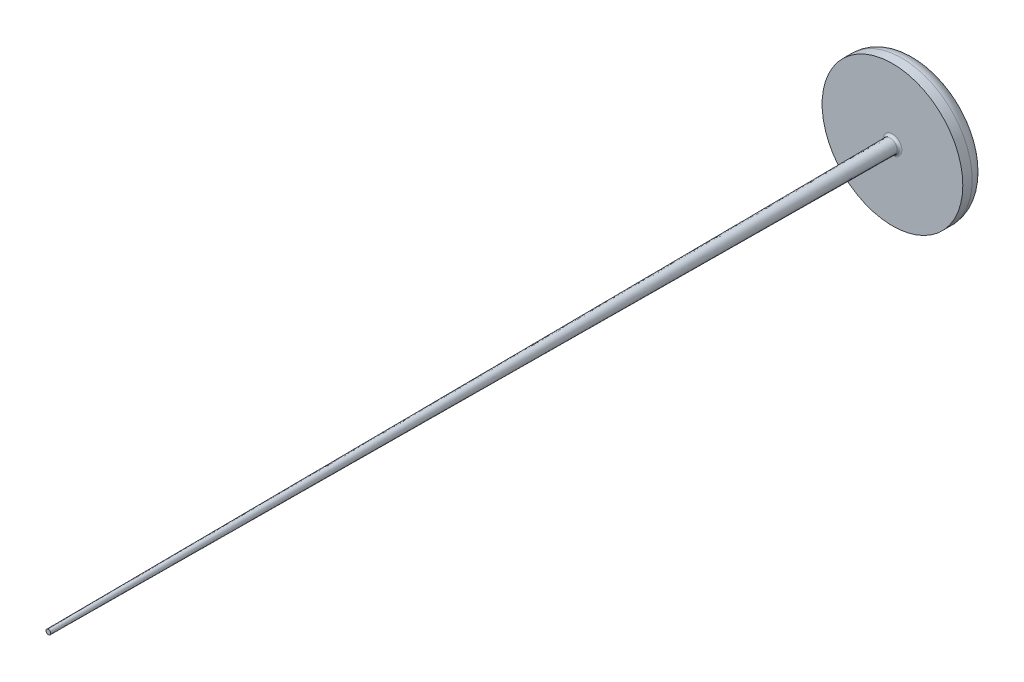
ISO-10303-21;
HEADER;
FILE_DESCRIPTION(('STEP AP214'),'2;1');
FILE_NAME('part.step','',(''),(''),'','','');
FILE_SCHEMA(('AUTOMOTIVE_DESIGN { 1 0 10303 214 1 1 1 1 }'));
ENDSEC;
DATA;
#1=APPLICATION_CONTEXT('core data for automotive mechanical design processes');
#2=APPLICATION_PROTOCOL_DEFINITION('international standard','automotive_design',2000,#1);
#3=PRODUCT_CONTEXT('',#1,'mechanical');
#4=PRODUCT('Part','Part','',(#3));
#5=PRODUCT_RELATED_PRODUCT_CATEGORY('part','',(#4));
#6=PRODUCT_DEFINITION_FORMATION('','',#4);
#7=PRODUCT_DEFINITION_CONTEXT('part definition',#1,'design');
#8=PRODUCT_DEFINITION('design','',#6,#7);
#9=PRODUCT_DEFINITION_SHAPE('','',#8);
#10=(LENGTH_UNIT() NAMED_UNIT(*) SI_UNIT(.MILLI.,.METRE.));
#11=(NAMED_UNIT(*) PLANE_ANGLE_UNIT() SI_UNIT($,.RADIAN.));
#12=(NAMED_UNIT(*) SI_UNIT($,.STERADIAN.) SOLID_ANGLE_UNIT());
#13=UNCERTAINTY_MEASURE_WITH_UNIT(LENGTH_MEASURE(1.E-05),#10,'distance_accuracy_value','');
#14=(GEOMETRIC_REPRESENTATION_CONTEXT(3) GLOBAL_UNCERTAINTY_ASSIGNED_CONTEXT((#13)) GLOBAL_UNIT_ASSIGNED_CONTEXT((#10,
#11,#12)) REPRESENTATION_CONTEXT('',''));
#15=CARTESIAN_POINT('',(0.,0.,0.));
#16=DIRECTION('',(0.,0.,1.));
#17=DIRECTION('',(1.,0.,0.));
#18=AXIS2_PLACEMENT_3D('',#15,#16,#17);
#19=CARTESIAN_POINT('',(0.,0.,211.));
#20=DIRECTION('',(0.,0.,1.));
#21=DIRECTION('',(1.,0.,0.));
#22=AXIS2_PLACEMENT_3D('',#19,#20,#21);
#23=PLANE('',#22);
#24=CARTESIAN_POINT('',(0.,0.,211.));
#25=DIRECTION('',(0.,0.,1.));
#26=DIRECTION('',(1.,0.,0.));
#27=AXIS2_PLACEMENT_3D('',#24,#25,#26);
#28=CIRCLE('',#27,0.499999999999966);
#29=CARTESIAN_POINT('',(0.305459621935444,-0.395846459333693,211.));
#30=VERTEX_POINT('',#29);
#31=EDGE_CURVE('E61',#30,#30,#28,.T.);
#32=ORIENTED_EDGE('',*,*,#31,.T.);
#33=EDGE_LOOP('',(#32));
#34=FACE_BOUND('',#33,.T.);
#35=ADVANCED_FACE('F41',(#34),#23,.T.);
#36=CARTESIAN_POINT('',(0.305459621935444,-0.395846459333693,211.));
#37=CARTESIAN_POINT('',(1.30248005570267,-0.744006521810648,31.));
#38=CARTESIAN_POINT('',(-0.486233296731943,-1.00676570320458,211.));
#39=CARTESIAN_POINT('',(-0.185532987918629,-3.34896663321598,31.));
#40=CARTESIAN_POINT('',(-1.09715254060283,-0.215072784537195,211.));
#41=CARTESIAN_POINT('',(-2.79049309932396,-1.86095358959469,31.));
#42=CARTESIAN_POINT('',(-0.305459621935444,0.395846459333693,211.));
#43=CARTESIAN_POINT('',(-1.30248005570267,0.744006521810648,31.));
#44=CARTESIAN_POINT('',(0.486233296731942,1.00676570320458,211.));
#45=CARTESIAN_POINT('',(0.18553298791863,3.34896663321598,31.));
#46=CARTESIAN_POINT('',(1.09715254060283,0.215072784537195,211.));
#47=CARTESIAN_POINT('',(2.79049309932397,1.86095358959468,31.));
#48=CARTESIAN_POINT('',(0.305459621935444,-0.395846459333693,211.));
#49=CARTESIAN_POINT('',(1.30248005570267,-0.744006521810648,31.));
#50=(BOUNDED_SURFACE() B_SPLINE_SURFACE(3,1,((#36,#37),(#38,#39),(#40,#41),(#42,#43),(#44,#45),
(#46,#47),(#48,#49)),.UNSPECIFIED.,.T.,.F.,.F.) B_SPLINE_SURFACE_WITH_KNOTS((4,3,4),(2,2),(0.,
0.5,1.),(0.,1.),.UNSPECIFIED.) GEOMETRIC_REPRESENTATION_ITEM() RATIONAL_B_SPLINE_SURFACE(((1.,
1.),(0.333333333333333,0.333333333333333),(0.333333333333333,0.333333333333333),(1.,1.),
(0.333333333333334,0.333333333333333),(0.333333333333334,0.333333333333333),(1.,1.))) REPRESENTATION_ITEM('') SURFACE());
#51=CARTESIAN_POINT('',(0.,0.,31.4971157326943));
#52=DIRECTION('',(0.,0.,-1.));
#53=DIRECTION('',(-1.,0.,0.));
#54=AXIS2_PLACEMENT_3D('',#51,#52,#53);
#55=CIRCLE('',#54,1.49713222868578);
#56=CARTESIAN_POINT('',(1.29972653046132,-0.743044989340909,31.4971157326942));
#57=VERTEX_POINT('',#56);
#58=EDGE_CURVE('E48',#57,#57,#55,.F.);
#59=CARTESIAN_POINT('',(1.29972653046132,-0.743044989340909,31.4971157326942));
#60=CARTESIAN_POINT('',(1.2893695834975,-0.739428337986667,33.366937443812));
#61=CARTESIAN_POINT('',(1.27901263653369,-0.735811686632425,35.2367591549298));
#62=CARTESIAN_POINT('',(1.25829874260607,-0.728578383923941,38.9764025771653));
#63=CARTESIAN_POINT('',(1.24794179564226,-0.7249617325697,40.8462242882831));
#64=CARTESIAN_POINT('',(1.22722790171464,-0.717728429861216,44.5858677105186));
#65=CARTESIAN_POINT('',(1.21687095475083,-0.714111778506974,46.4556894216364));
#66=CARTESIAN_POINT('',(1.1961570608232,-0.706878475798491,50.1953328438719));
#67=CARTESIAN_POINT('',(1.18580011385939,-0.703261824444249,52.0651545549897));
#68=CARTESIAN_POINT('',(1.16508621993177,-0.696028521735765,55.8047979772252));
#69=CARTESIAN_POINT('',(1.15472927296796,-0.692411870381523,57.674619688343));
#70=CARTESIAN_POINT('',(1.13401537904034,-0.68517856767304,61.4142631105785));
#71=CARTESIAN_POINT('',(1.12365843207653,-0.681561916318798,63.2840848216963));
#72=CARTESIAN_POINT('',(1.1029445381489,-0.674328613610314,67.0237282439319));
#73=CARTESIAN_POINT('',(1.09258759118509,-0.670711962256072,68.8935499550496));
#74=CARTESIAN_POINT('',(1.07187369725747,-0.663478659547589,72.6331933772852));
#75=CARTESIAN_POINT('',(1.06151675029366,-0.659862008193347,74.5030150884029));
#76=CARTESIAN_POINT('',(1.04080285636604,-0.652628705484863,78.2426585106384));
#77=CARTESIAN_POINT('',(1.03044590940222,-0.649012054130621,80.1124802217562));
#78=CARTESIAN_POINT('',(1.0097320154746,-0.641778751422138,83.8521236439918));
#79=CARTESIAN_POINT('',(0.999375068510791,-0.638162100067896,85.7219453551095));
#80=CARTESIAN_POINT('',(0.978661174583169,-0.630928797359412,89.4615887773451));
#81=CARTESIAN_POINT('',(0.968304227619358,-0.62731214600517,91.3314104884628));
#82=CARTESIAN_POINT('',(0.947590333691736,-0.620078843296687,95.0710539106984));
#83=CARTESIAN_POINT('',(0.937233386727925,-0.616462191942445,96.9408756218161));
#84=CARTESIAN_POINT('',(0.916519492800302,-0.609228889233961,100.680519044052));
#85=CARTESIAN_POINT('',(0.906162545836491,-0.605612237879719,102.550340755169));
#86=CARTESIAN_POINT('',(0.885448651908869,-0.598378935171236,106.289984177405));
#87=CARTESIAN_POINT('',(0.875091704945058,-0.594762283816994,108.159805888523));
#88=CARTESIAN_POINT('',(0.854377811017435,-0.58752898110851,111.899449310758));
#89=CARTESIAN_POINT('',(0.844020864053624,-0.583912329754268,113.769271021876));
#90=CARTESIAN_POINT('',(0.823306970126002,-0.576679027045785,117.508914444112));
#91=CARTESIAN_POINT('',(0.812950023162191,-0.573062375691543,119.378736155229));
#92=CARTESIAN_POINT('',(0.792236129234568,-0.565829072983059,123.118379577465));
#93=CARTESIAN_POINT('',(0.781879182270757,-0.562212421628817,124.988201288583));
#94=CARTESIAN_POINT('',(0.761165288343135,-0.554979118920334,128.727844710818));
#95=CARTESIAN_POINT('',(0.750808341379324,-0.551362467566092,130.597666421936));
#96=CARTESIAN_POINT('',(0.730094447451702,-0.544129164857608,134.337309844172));
#97=CARTESIAN_POINT('',(0.71973750048789,-0.540512513503366,136.207131555289));
#98=CARTESIAN_POINT('',(0.699023606560268,-0.533279210794883,139.946774977525));
#99=CARTESIAN_POINT('',(0.688666659596457,-0.529662559440641,141.816596688643));
#100=CARTESIAN_POINT('',(0.667952765668835,-0.522429256732157,145.556240110878));
#101=CARTESIAN_POINT('',(0.657595818705023,-0.518812605377916,147.426061821996));
#102=CARTESIAN_POINT('',(0.636881924777401,-0.511579302669432,151.165705244231));
#103=CARTESIAN_POINT('',(0.62652497781359,-0.50796265131519,153.035526955349));
#104=CARTESIAN_POINT('',(0.605811083885968,-0.500729348606706,156.775170377585));
#105=CARTESIAN_POINT('',(0.595454136922156,-0.497112697252464,158.644992088703));
#106=CARTESIAN_POINT('',(0.574740242994534,-0.489879394543981,162.384635510938));
#107=CARTESIAN_POINT('',(0.564383296030723,-0.486262743189739,164.254457222056));
#108=CARTESIAN_POINT('',(0.543669402103101,-0.479029440481255,167.994100644291));
#109=CARTESIAN_POINT('',(0.533312455139289,-0.475412789127014,169.863922355409));
#110=CARTESIAN_POINT('',(0.512598561211667,-0.46817948641853,173.603565777645));
#111=CARTESIAN_POINT('',(0.502241614247856,-0.464562835064288,175.473387488762));
#112=CARTESIAN_POINT('',(0.481527720320234,-0.457329532355804,179.213030910998));
#113=CARTESIAN_POINT('',(0.471170773356423,-0.453712881001563,181.082852622116));
#114=CARTESIAN_POINT('',(0.4504568794288,-0.446479578293079,184.822496044351));
#115=CARTESIAN_POINT('',(0.440099932464989,-0.442862926938837,186.692317755469));
#116=CARTESIAN_POINT('',(0.419386038537367,-0.435629624230354,190.431961177705));
#117=CARTESIAN_POINT('',(0.409029091573556,-0.432012972876112,192.301782888822));
#118=CARTESIAN_POINT('',(0.388315197645933,-0.424779670167628,196.041426311058));
#119=CARTESIAN_POINT('',(0.377958250682122,-0.421163018813386,197.911248022176));
#120=CARTESIAN_POINT('',(0.3572443567545,-0.413929716104903,201.650891444411));
#121=CARTESIAN_POINT('',(0.346887409790689,-0.410313064750661,203.520713155529));
#122=CARTESIAN_POINT('',(0.326173515863066,-0.403079762042177,207.260356577764));
#123=CARTESIAN_POINT('',(0.315816568899255,-0.399463110687935,209.130178288882));
#124=CARTESIAN_POINT('',(0.305459621935444,-0.395846459333693,211.));
#125=B_SPLINE_CURVE_WITH_KNOTS('',3,(#59,#60,#61,#62,#63,#64,#65,#66,#67,#68,#69,#70,#71,#72,
#73,#74,#75,#76,#77,#78,#79,#80,#81,#82,#83,#84,#85,#86,#87,#88,#89,#90,#91,#92,#93,#94,#95,#96,
#97,#98,#99,#100,#101,#102,#103,#104,#105,#106,#107,#108,#109,#110,#111,#112,#113,#114,#115,
#116,#117,#118,#119,#120,#121,#122,#123,#124),.UNSPECIFIED.,.F.,.F.,(4,2,2,2,2,2,2,2,2,2,2,2,2,
2,2,2,2,2,2,2,2,2,2,2,2,2,2,2,2,2,2,2,4),(0.,5.60956167636682,11.2191233527336,16.8286850291004,
22.4382467054673,28.0478083818341,33.6573700582009,39.2669317345677,44.8764934109345,
50.4860550873014,56.0956167636682,61.705178440035,67.3147401164018,72.9243017927686,
78.5338634691355,84.1434251455023,89.7529868218691,95.3625484982359,100.972110174603,
106.581671850969,112.191233527336,117.800795203703,123.41035688007,129.019918556437,
134.629480232804,140.23904190917,145.848603585537,151.458165261904,157.067726938271,
162.677288614638,168.286850291004,173.896411967371,179.505973643738),.UNSPECIFIED.);
#126=EDGE_CURVE('BSEAM81',#57,#30,#125,.T.);
#127=ORIENTED_EDGE('',*,*,#58,.T.);
#128=ORIENTED_EDGE('',*,*,#31,.F.);
#129=ORIENTED_EDGE('',*,*,#126,.T.);
#130=ORIENTED_EDGE('',*,*,#126,.F.);
#131=EDGE_LOOP('',(#127,#129,#128,#130));
#132=FACE_BOUND('',#131,.T.);
#133=ADVANCED_FACE('F81',(#132),#50,.T.);
#134=CARTESIAN_POINT('',(0.,0.,26.));
#135=DIRECTION('',(0.,0.,1.));
#136=DIRECTION('',(1.,0.,0.));
#137=AXIS2_PLACEMENT_3D('',#134,#135,#136);
#138=CYLINDRICAL_SURFACE('',#137,15.);
#139=CARTESIAN_POINT('',(0.,0.,29.));
#140=DIRECTION('',(0.,0.,1.));
#141=DIRECTION('',(1.,0.,0.));
#142=AXIS2_PLACEMENT_3D('',#139,#140,#141);
#143=CIRCLE('',#142,15.);
#144=CARTESIAN_POINT('',(15.,0.,29.));
#145=VERTEX_POINT('',#144);
#146=EDGE_CURVE('E56',#145,#145,#143,.T.);
#147=ORIENTED_EDGE('',*,*,#146,.T.);
#148=EDGE_LOOP('',(#147));
#149=FACE_BOUND('',#148,.T.);
#150=CARTESIAN_POINT('',(0.,0.,31.));
#151=DIRECTION('',(0.,0.,1.));
#152=DIRECTION('',(1.,0.,0.));
#153=AXIS2_PLACEMENT_3D('',#150,#151,#152);
#154=CIRCLE('',#153,15.);
#155=CARTESIAN_POINT('',(15.,0.,31.));
#156=VERTEX_POINT('',#155);
#157=EDGE_CURVE('E66',#156,#156,#154,.T.);
#158=ORIENTED_EDGE('',*,*,#157,.F.);
#159=EDGE_LOOP('',(#158));
#160=FACE_BOUND('',#159,.T.);
#161=ADVANCED_FACE('F83',(#149,#160),#138,.T.);
#162=CARTESIAN_POINT('',(0.,0.,26.));
#163=DIRECTION('',(0.,0.,1.));
#164=DIRECTION('',(1.,0.,0.));
#165=AXIS2_PLACEMENT_3D('',#162,#163,#164);
#166=PLANE('',#165);
#167=CARTESIAN_POINT('',(0.,0.,26.));
#168=DIRECTION('',(0.,0.,1.));
#169=DIRECTION('',(1.,0.,0.));
#170=AXIS2_PLACEMENT_3D('',#167,#168,#169);
#171=CIRCLE('',#170,12.);
#172=CARTESIAN_POINT('',(12.,0.,26.));
#173=VERTEX_POINT('',#172);
#174=EDGE_CURVE('E52',#173,#173,#171,.F.);
#175=ORIENTED_EDGE('',*,*,#174,.T.);
#176=EDGE_LOOP('',(#175));
#177=FACE_BOUND('',#176,.T.);
#178=ADVANCED_FACE('F112',(#177),#166,.F.);
#179=CARTESIAN_POINT('',(0.,0.,31.));
#180=DIRECTION('',(0.,0.,1.));
#181=DIRECTION('',(1.,0.,0.));
#182=AXIS2_PLACEMENT_3D('',#179,#180,#181);
#183=PLANE('',#182);
#184=CARTESIAN_POINT('',(0.,0.,31.));
#185=DIRECTION('',(0.,0.,1.));
#186=DIRECTION('',(1.,0.,0.));
#187=AXIS2_PLACEMENT_3D('',#184,#185,#186);
#188=CIRCLE('',#187,1.99712390961868);
#189=CARTESIAN_POINT('',(1.99712390961868,0.,31.));
#190=VERTEX_POINT('',#189);
#191=EDGE_CURVE('E11',#190,#190,#188,.F.);
#192=ORIENTED_EDGE('',*,*,#191,.T.);
#193=EDGE_LOOP('',(#192));
#194=FACE_BOUND('',#193,.T.);
#195=ORIENTED_EDGE('',*,*,#157,.T.);
#196=EDGE_LOOP('',(#195));
#197=FACE_BOUND('',#196,.T.);
#198=ADVANCED_FACE('F109',(#194,#197),#183,.T.);
#199=CARTESIAN_POINT('',(0.,0.,29.));
#200=DIRECTION('',(0.,0.,1.));
#201=DIRECTION('',(1.,0.,0.));
#202=AXIS2_PLACEMENT_3D('',#199,#200,#201);
#203=TOROIDAL_SURFACE('',#202,12.,3.);
#204=ORIENTED_EDGE('',*,*,#174,.F.);
#205=EDGE_LOOP('',(#204));
#206=FACE_BOUND('',#205,.T.);
#207=ORIENTED_EDGE('',*,*,#146,.F.);
#208=EDGE_LOOP('',(#207));
#209=FACE_BOUND('',#208,.T.);
#210=ADVANCED_FACE('F89',(#206,#209),#203,.T.);
#211=CARTESIAN_POINT('',(0.,0.,31.5));
#212=DIRECTION('',(0.,0.,-1.));
#213=DIRECTION('',(-1.,0.,0.));
#214=AXIS2_PLACEMENT_3D('',#211,#212,#213);
#215=TOROIDAL_SURFACE('',#214,1.99712390961868,0.5);
#216=ORIENTED_EDGE('',*,*,#191,.F.);
#217=EDGE_LOOP('',(#216));
#218=FACE_BOUND('',#217,.T.);
#219=ORIENTED_EDGE('',*,*,#58,.F.);
#220=EDGE_LOOP('',(#219));
#221=FACE_BOUND('',#220,.T.);
#222=ADVANCED_FACE('F43',(#218,#221),#215,.F.);
#223=CLOSED_SHELL('',(#35,#133,#161,#178,#198,#210,#222));
#224=MANIFOLD_SOLID_BREP('B2',#223);
#225=ADVANCED_BREP_SHAPE_REPRESENTATION('',(#18,#224),#14);
#226=SHAPE_DEFINITION_REPRESENTATION(#9,#225);
ENDSEC;
END-ISO-10303-21;
